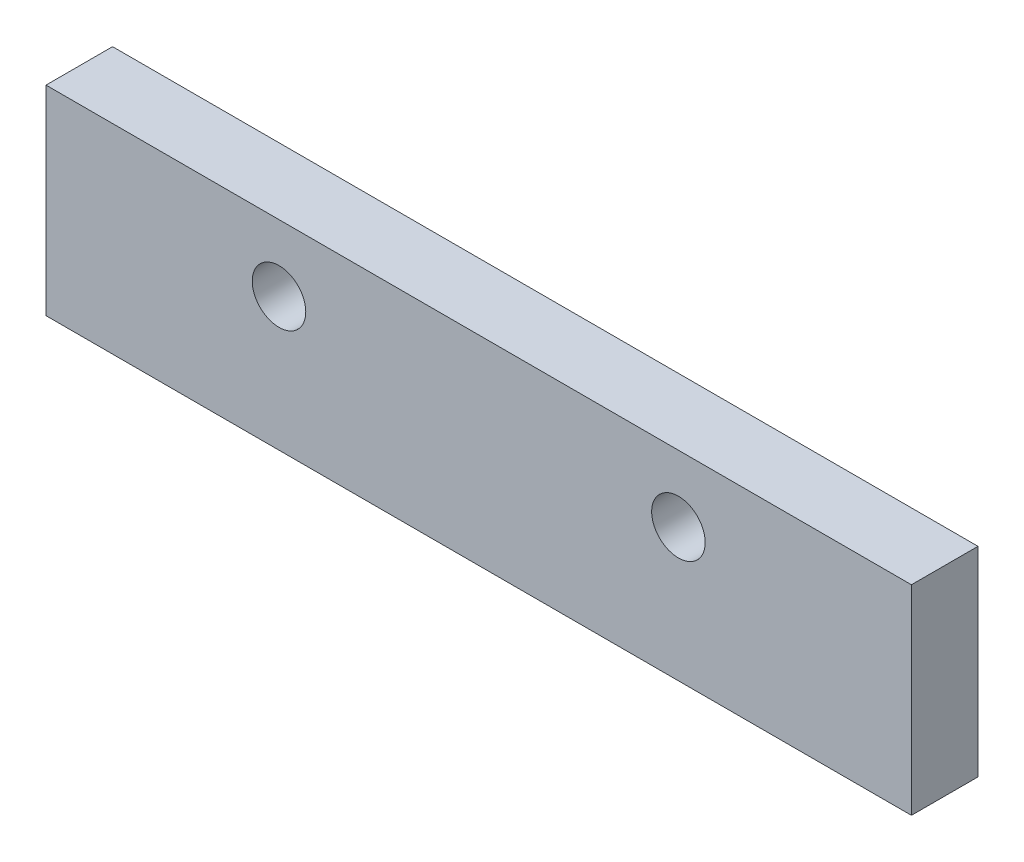
ISO-10303-21;
HEADER;
FILE_DESCRIPTION(('STEP AP214'),'2;1');
FILE_NAME('part.step','',(''),(''),'','','');
FILE_SCHEMA(('AUTOMOTIVE_DESIGN { 1 0 10303 214 1 1 1 1 }'));
ENDSEC;
DATA;
#1=APPLICATION_CONTEXT('core data for automotive mechanical design processes');
#2=APPLICATION_PROTOCOL_DEFINITION('international standard','automotive_design',2000,#1);
#3=PRODUCT_CONTEXT('',#1,'mechanical');
#4=PRODUCT('Part','Part','',(#3));
#5=PRODUCT_RELATED_PRODUCT_CATEGORY('part','',(#4));
#6=PRODUCT_DEFINITION_FORMATION('','',#4);
#7=PRODUCT_DEFINITION_CONTEXT('part definition',#1,'design');
#8=PRODUCT_DEFINITION('design','',#6,#7);
#9=PRODUCT_DEFINITION_SHAPE('','',#8);
#10=(LENGTH_UNIT() NAMED_UNIT(*) SI_UNIT(.MILLI.,.METRE.));
#11=(NAMED_UNIT(*) PLANE_ANGLE_UNIT() SI_UNIT($,.RADIAN.));
#12=(NAMED_UNIT(*) SI_UNIT($,.STERADIAN.) SOLID_ANGLE_UNIT());
#13=UNCERTAINTY_MEASURE_WITH_UNIT(LENGTH_MEASURE(1.E-05),#10,'distance_accuracy_value','');
#14=(GEOMETRIC_REPRESENTATION_CONTEXT(3) GLOBAL_UNCERTAINTY_ASSIGNED_CONTEXT((#13)) GLOBAL_UNIT_ASSIGNED_CONTEXT((#10,
#11,#12)) REPRESENTATION_CONTEXT('',''));
#15=CARTESIAN_POINT('',(0.,0.,0.));
#16=DIRECTION('',(0.,0.,1.));
#17=DIRECTION('',(1.,0.,0.));
#18=AXIS2_PLACEMENT_3D('',#15,#16,#17);
#19=CARTESIAN_POINT('',(0.,0.,-6.35));
#20=DIRECTION('',(-1.,0.,0.));
#21=DIRECTION('',(0.,0.,1.));
#22=AXIS2_PLACEMENT_3D('',#19,#20,#21);
#23=PLANE('',#22);
#24=DIRECTION('',(0.,-1.,0.));
#25=VECTOR('',#24,1.);
#26=CARTESIAN_POINT('',(0.,0.,0.));
#27=LINE('',#26,#25);
#28=CARTESIAN_POINT('',(0.,19.05,0.));
#29=VERTEX_POINT('',#28);
#30=CARTESIAN_POINT('',(0.,0.,0.));
#31=VERTEX_POINT('',#30);
#32=EDGE_CURVE('E104',#29,#31,#27,.T.);
#33=ORIENTED_EDGE('',*,*,#32,.F.);
#34=DIRECTION('',(0.,0.,1.));
#35=VECTOR('',#34,1.);
#36=CARTESIAN_POINT('',(0.,19.05,-6.35));
#37=LINE('',#36,#35);
#38=CARTESIAN_POINT('',(0.,19.05,-6.35));
#39=VERTEX_POINT('',#38);
#40=EDGE_CURVE('E11',#39,#29,#37,.T.);
#41=ORIENTED_EDGE('',*,*,#40,.F.);
#42=DIRECTION('',(0.,-1.,0.));
#43=VECTOR('',#42,1.);
#44=CARTESIAN_POINT('',(0.,0.,-6.35));
#45=LINE('',#44,#43);
#46=CARTESIAN_POINT('',(0.,0.,-6.35));
#47=VERTEX_POINT('',#46);
#48=EDGE_CURVE('E97',#39,#47,#45,.T.);
#49=ORIENTED_EDGE('',*,*,#48,.T.);
#50=DIRECTION('',(0.,0.,1.));
#51=VECTOR('',#50,1.);
#52=CARTESIAN_POINT('',(0.,0.,-6.35));
#53=LINE('',#52,#51);
#54=EDGE_CURVE('E42',#47,#31,#53,.T.);
#55=ORIENTED_EDGE('',*,*,#54,.T.);
#56=EDGE_LOOP('',(#33,#41,#49,#55));
#57=FACE_BOUND('',#56,.T.);
#58=ADVANCED_FACE('F39',(#57),#23,.T.);
#59=CARTESIAN_POINT('',(0.,19.05,-6.35));
#60=DIRECTION('',(0.,1.,0.));
#61=DIRECTION('',(0.,0.,1.));
#62=AXIS2_PLACEMENT_3D('',#59,#60,#61);
#63=PLANE('',#62);
#64=DIRECTION('',(-1.,0.,0.));
#65=VECTOR('',#64,1.);
#66=CARTESIAN_POINT('',(0.,19.05,0.));
#67=LINE('',#66,#65);
#68=CARTESIAN_POINT('',(82.55,19.05,0.));
#69=VERTEX_POINT('',#68);
#70=EDGE_CURVE('E99',#69,#29,#67,.T.);
#71=ORIENTED_EDGE('',*,*,#70,.F.);
#72=DIRECTION('',(0.,0.,1.));
#73=VECTOR('',#72,1.);
#74=CARTESIAN_POINT('',(82.55,19.05,-6.35));
#75=LINE('',#74,#73);
#76=CARTESIAN_POINT('',(82.55,19.05,-6.35));
#77=VERTEX_POINT('',#76);
#78=EDGE_CURVE('E48',#77,#69,#75,.T.);
#79=ORIENTED_EDGE('',*,*,#78,.F.);
#80=DIRECTION('',(-1.,0.,0.));
#81=VECTOR('',#80,1.);
#82=CARTESIAN_POINT('',(0.,19.05,-6.35));
#83=LINE('',#82,#81);
#84=EDGE_CURVE('E94',#77,#39,#83,.T.);
#85=ORIENTED_EDGE('',*,*,#84,.T.);
#86=ORIENTED_EDGE('',*,*,#40,.T.);
#87=EDGE_LOOP('',(#71,#79,#85,#86));
#88=FACE_BOUND('',#87,.T.);
#89=ADVANCED_FACE('F115',(#88),#63,.T.);
#90=CARTESIAN_POINT('',(82.55,0.,-6.35));
#91=DIRECTION('',(1.,0.,0.));
#92=DIRECTION('',(0.,0.,-1.));
#93=AXIS2_PLACEMENT_3D('',#90,#91,#92);
#94=PLANE('',#93);
#95=DIRECTION('',(0.,1.,0.));
#96=VECTOR('',#95,1.);
#97=CARTESIAN_POINT('',(82.55,0.,0.));
#98=LINE('',#97,#96);
#99=CARTESIAN_POINT('',(82.55,0.,0.));
#100=VERTEX_POINT('',#99);
#101=EDGE_CURVE('E89',#100,#69,#98,.T.);
#102=ORIENTED_EDGE('',*,*,#101,.F.);
#103=DIRECTION('',(0.,0.,1.));
#104=VECTOR('',#103,1.);
#105=CARTESIAN_POINT('',(82.55,0.,-6.35));
#106=LINE('',#105,#104);
#107=CARTESIAN_POINT('',(82.55,0.,-6.35));
#108=VERTEX_POINT('',#107);
#109=EDGE_CURVE('E84',#108,#100,#106,.T.);
#110=ORIENTED_EDGE('',*,*,#109,.F.);
#111=DIRECTION('',(0.,1.,0.));
#112=VECTOR('',#111,1.);
#113=CARTESIAN_POINT('',(82.55,0.,-6.35));
#114=LINE('',#113,#112);
#115=EDGE_CURVE('E87',#108,#77,#114,.T.);
#116=ORIENTED_EDGE('',*,*,#115,.T.);
#117=ORIENTED_EDGE('',*,*,#78,.T.);
#118=EDGE_LOOP('',(#102,#110,#116,#117));
#119=FACE_BOUND('',#118,.T.);
#120=ADVANCED_FACE('F86',(#119),#94,.T.);
#121=CARTESIAN_POINT('',(0.,0.,-6.35));
#122=DIRECTION('',(0.,-1.,0.));
#123=DIRECTION('',(0.,0.,-1.));
#124=AXIS2_PLACEMENT_3D('',#121,#122,#123);
#125=PLANE('',#124);
#126=DIRECTION('',(1.,0.,0.));
#127=VECTOR('',#126,1.);
#128=CARTESIAN_POINT('',(0.,0.,0.));
#129=LINE('',#128,#127);
#130=EDGE_CURVE('E107',#31,#100,#129,.T.);
#131=ORIENTED_EDGE('',*,*,#130,.F.);
#132=ORIENTED_EDGE('',*,*,#54,.F.);
#133=DIRECTION('',(1.,0.,0.));
#134=VECTOR('',#133,1.);
#135=CARTESIAN_POINT('',(0.,0.,-6.35));
#136=LINE('',#135,#134);
#137=EDGE_CURVE('E93',#47,#108,#136,.T.);
#138=ORIENTED_EDGE('',*,*,#137,.T.);
#139=ORIENTED_EDGE('',*,*,#109,.T.);
#140=EDGE_LOOP('',(#131,#132,#138,#139));
#141=FACE_BOUND('',#140,.T.);
#142=ADVANCED_FACE('F96',(#141),#125,.T.);
#143=CARTESIAN_POINT('',(0.,0.,-6.35));
#144=DIRECTION('',(0.,0.,-1.));
#145=DIRECTION('',(-1.,0.,0.));
#146=AXIS2_PLACEMENT_3D('',#143,#144,#145);
#147=PLANE('',#146);
#148=CARTESIAN_POINT('',(22.225,12.7,-6.35));
#149=DIRECTION('',(0.,0.,1.));
#150=DIRECTION('',(1.,0.,0.));
#151=AXIS2_PLACEMENT_3D('',#148,#149,#150);
#152=CIRCLE('',#151,2.5527);
#153=CARTESIAN_POINT('',(24.7777,12.7,-6.35));
#154=VERTEX_POINT('',#153);
#155=EDGE_CURVE('E148',#154,#154,#152,.T.);
#156=ORIENTED_EDGE('',*,*,#155,.T.);
#157=EDGE_LOOP('',(#156));
#158=FACE_BOUND('',#157,.T.);
#159=CARTESIAN_POINT('',(60.325,12.7,-6.35));
#160=DIRECTION('',(0.,0.,1.));
#161=DIRECTION('',(1.,0.,0.));
#162=AXIS2_PLACEMENT_3D('',#159,#160,#161);
#163=CIRCLE('',#162,2.55269999999999);
#164=CARTESIAN_POINT('',(62.8777,12.7,-6.35));
#165=VERTEX_POINT('',#164);
#166=EDGE_CURVE('E108',#165,#165,#163,.T.);
#167=ORIENTED_EDGE('',*,*,#166,.T.);
#168=EDGE_LOOP('',(#167));
#169=FACE_BOUND('',#168,.T.);
#170=ORIENTED_EDGE('',*,*,#48,.F.);
#171=ORIENTED_EDGE('',*,*,#84,.F.);
#172=ORIENTED_EDGE('',*,*,#115,.F.);
#173=ORIENTED_EDGE('',*,*,#137,.F.);
#174=EDGE_LOOP('',(#170,#171,#172,#173));
#175=FACE_BOUND('',#174,.T.);
#176=ADVANCED_FACE('F92',(#158,#169,#175),#147,.T.);
#177=CARTESIAN_POINT('',(0.,0.,0.));
#178=DIRECTION('',(0.,0.,-1.));
#179=DIRECTION('',(-1.,0.,0.));
#180=AXIS2_PLACEMENT_3D('',#177,#178,#179);
#181=PLANE('',#180);
#182=CARTESIAN_POINT('',(22.225,12.7,0.));
#183=DIRECTION('',(0.,0.,1.));
#184=DIRECTION('',(1.,0.,0.));
#185=AXIS2_PLACEMENT_3D('',#182,#183,#184);
#186=CIRCLE('',#185,2.55269999999999);
#187=CARTESIAN_POINT('',(24.7777,12.7,0.));
#188=VERTEX_POINT('',#187);
#189=EDGE_CURVE('E151',#188,#188,#186,.T.);
#190=ORIENTED_EDGE('',*,*,#189,.F.);
#191=EDGE_LOOP('',(#190));
#192=FACE_BOUND('',#191,.T.);
#193=CARTESIAN_POINT('',(60.325,12.7,0.));
#194=DIRECTION('',(0.,0.,1.));
#195=DIRECTION('',(1.,0.,0.));
#196=AXIS2_PLACEMENT_3D('',#193,#194,#195);
#197=CIRCLE('',#196,2.55269999999999);
#198=CARTESIAN_POINT('',(62.8777,12.7,0.));
#199=VERTEX_POINT('',#198);
#200=EDGE_CURVE('E153',#199,#199,#197,.T.);
#201=ORIENTED_EDGE('',*,*,#200,.F.);
#202=EDGE_LOOP('',(#201));
#203=FACE_BOUND('',#202,.T.);
#204=ORIENTED_EDGE('',*,*,#32,.T.);
#205=ORIENTED_EDGE('',*,*,#130,.T.);
#206=ORIENTED_EDGE('',*,*,#101,.T.);
#207=ORIENTED_EDGE('',*,*,#70,.T.);
#208=EDGE_LOOP('',(#204,#205,#206,#207));
#209=FACE_BOUND('',#208,.T.);
#210=ADVANCED_FACE('F114',(#192,#203,#209),#181,.F.);
#211=CARTESIAN_POINT('',(60.325,12.7,0.));
#212=DIRECTION('',(0.,0.,1.));
#213=DIRECTION('',(1.,0.,0.));
#214=AXIS2_PLACEMENT_3D('',#211,#212,#213);
#215=CYLINDRICAL_SURFACE('',#214,2.55269999999999);
#216=ORIENTED_EDGE('',*,*,#166,.F.);
#217=EDGE_LOOP('',(#216));
#218=FACE_BOUND('',#217,.T.);
#219=ORIENTED_EDGE('',*,*,#200,.T.);
#220=EDGE_LOOP('',(#219));
#221=FACE_BOUND('',#220,.T.);
#222=ADVANCED_FACE('F133',(#218,#221),#215,.F.);
#223=CARTESIAN_POINT('',(22.225,12.7,0.));
#224=DIRECTION('',(0.,0.,1.));
#225=DIRECTION('',(1.,0.,0.));
#226=AXIS2_PLACEMENT_3D('',#223,#224,#225);
#227=CYLINDRICAL_SURFACE('',#226,2.55269999999999);
#228=ORIENTED_EDGE('',*,*,#155,.F.);
#229=EDGE_LOOP('',(#228));
#230=FACE_BOUND('',#229,.T.);
#231=ORIENTED_EDGE('',*,*,#189,.T.);
#232=EDGE_LOOP('',(#231));
#233=FACE_BOUND('',#232,.T.);
#234=ADVANCED_FACE('F140',(#230,#233),#227,.F.);
#235=CLOSED_SHELL('',(#58,#89,#120,#142,#176,#210,#222,#234));
#236=MANIFOLD_SOLID_BREP('B2',#235);
#237=ADVANCED_BREP_SHAPE_REPRESENTATION('',(#18,#236),#14);
#238=SHAPE_DEFINITION_REPRESENTATION(#9,#237);
ENDSEC;
END-ISO-10303-21;
